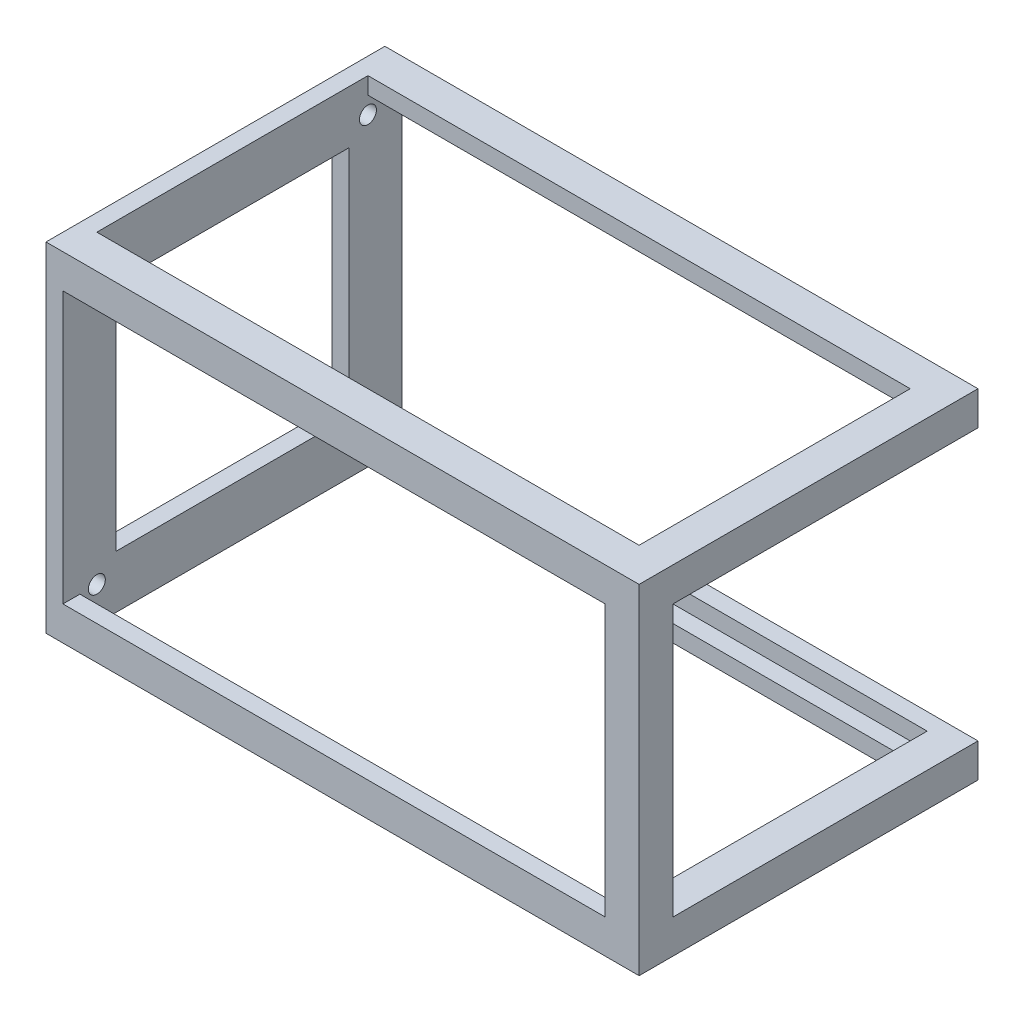
ISO-10303-21;
HEADER;
FILE_DESCRIPTION(('STEP AP214'),'2;1');
FILE_NAME('part.step','',(''),(''),'','','');
FILE_SCHEMA(('AUTOMOTIVE_DESIGN { 1 0 10303 214 1 1 1 1 }'));
ENDSEC;
DATA;
#1=APPLICATION_CONTEXT('core data for automotive mechanical design processes');
#2=APPLICATION_PROTOCOL_DEFINITION('international standard','automotive_design',2000,#1);
#3=PRODUCT_CONTEXT('',#1,'mechanical');
#4=PRODUCT('Part','Part','',(#3));
#5=PRODUCT_RELATED_PRODUCT_CATEGORY('part','',(#4));
#6=PRODUCT_DEFINITION_FORMATION('','',#4);
#7=PRODUCT_DEFINITION_CONTEXT('part definition',#1,'design');
#8=PRODUCT_DEFINITION('design','',#6,#7);
#9=PRODUCT_DEFINITION_SHAPE('','',#8);
#10=(LENGTH_UNIT() NAMED_UNIT(*) SI_UNIT(.MILLI.,.METRE.));
#11=(NAMED_UNIT(*) PLANE_ANGLE_UNIT() SI_UNIT($,.RADIAN.));
#12=(NAMED_UNIT(*) SI_UNIT($,.STERADIAN.) SOLID_ANGLE_UNIT());
#13=UNCERTAINTY_MEASURE_WITH_UNIT(LENGTH_MEASURE(1.E-05),#10,'distance_accuracy_value','');
#14=(GEOMETRIC_REPRESENTATION_CONTEXT(3) GLOBAL_UNCERTAINTY_ASSIGNED_CONTEXT((#13)) GLOBAL_UNIT_ASSIGNED_CONTEXT((#10,
#11,#12)) REPRESENTATION_CONTEXT('',''));
#15=CARTESIAN_POINT('',(0.,0.,0.));
#16=DIRECTION('',(0.,0.,1.));
#17=DIRECTION('',(1.,0.,0.));
#18=AXIS2_PLACEMENT_3D('',#15,#16,#17);
#19=CARTESIAN_POINT('',(4.,-36.,36.));
#20=DIRECTION('',(0.,-1.,0.));
#21=DIRECTION('',(0.,0.,-1.));
#22=AXIS2_PLACEMENT_3D('',#19,#20,#21);
#23=PLANE('',#22);
#24=DIRECTION('',(0.,0.,1.));
#25=VECTOR('',#24,1.);
#26=CARTESIAN_POINT('',(132.,-36.,36.));
#27=LINE('',#26,#25);
#28=CARTESIAN_POINT('',(132.,-36.,32.0006053791459));
#29=VERTEX_POINT('',#28);
#30=CARTESIAN_POINT('',(132.,-36.,36.));
#31=VERTEX_POINT('',#30);
#32=EDGE_CURVE('E280',#29,#31,#27,.T.);
#33=ORIENTED_EDGE('',*,*,#32,.F.);
#34=DIRECTION('',(1.,0.,0.));
#35=VECTOR('',#34,1.);
#36=CARTESIAN_POINT('',(4.,-36.,32.0006053791459));
#37=LINE('',#36,#35);
#38=CARTESIAN_POINT('',(4.,-36.,32.0006053791459));
#39=VERTEX_POINT('',#38);
#40=EDGE_CURVE('E427',#39,#29,#37,.T.);
#41=ORIENTED_EDGE('',*,*,#40,.F.);
#42=DIRECTION('',(0.,0.,-1.));
#43=VECTOR('',#42,1.);
#44=CARTESIAN_POINT('',(4.,-36.,36.));
#45=LINE('',#44,#43);
#46=CARTESIAN_POINT('',(4.,-36.,36.));
#47=VERTEX_POINT('',#46);
#48=EDGE_CURVE('E367',#47,#39,#45,.T.);
#49=ORIENTED_EDGE('',*,*,#48,.F.);
#50=DIRECTION('',(1.,0.,0.));
#51=VECTOR('',#50,1.);
#52=CARTESIAN_POINT('',(4.,-36.,36.));
#53=LINE('',#52,#51);
#54=EDGE_CURVE('E433',#47,#31,#53,.T.);
#55=ORIENTED_EDGE('',*,*,#54,.T.);
#56=EDGE_LOOP('',(#33,#41,#49,#55));
#57=FACE_BOUND('',#56,.T.);
#58=ADVANCED_FACE('F39',(#57),#23,.F.);
#59=CARTESIAN_POINT('',(4.,-36.,36.));
#60=DIRECTION('',(0.,0.,1.));
#61=DIRECTION('',(1.,0.,0.));
#62=AXIS2_PLACEMENT_3D('',#59,#60,#61);
#63=PLANE('',#62);
#64=DIRECTION('',(0.,1.,0.));
#65=VECTOR('',#64,1.);
#66=CARTESIAN_POINT('',(132.,-36.,36.));
#67=LINE('',#66,#65);
#68=CARTESIAN_POINT('',(132.,-32.,36.));
#69=VERTEX_POINT('',#68);
#70=EDGE_CURVE('E53',#31,#69,#67,.T.);
#71=ORIENTED_EDGE('',*,*,#70,.F.);
#72=ORIENTED_EDGE('',*,*,#54,.F.);
#73=DIRECTION('',(0.,-1.,0.));
#74=VECTOR('',#73,1.);
#75=CARTESIAN_POINT('',(4.,-36.,36.));
#76=LINE('',#75,#74);
#77=CARTESIAN_POINT('',(4.,-32.,36.));
#78=VERTEX_POINT('',#77);
#79=EDGE_CURVE('E430',#78,#47,#76,.T.);
#80=ORIENTED_EDGE('',*,*,#79,.F.);
#81=DIRECTION('',(1.,0.,0.));
#82=VECTOR('',#81,1.);
#83=CARTESIAN_POINT('',(4.,-32.,36.));
#84=LINE('',#83,#82);
#85=EDGE_CURVE('E436',#78,#69,#84,.T.);
#86=ORIENTED_EDGE('',*,*,#85,.T.);
#87=EDGE_LOOP('',(#71,#72,#80,#86));
#88=FACE_BOUND('',#87,.T.);
#89=ADVANCED_FACE('F561',(#88),#63,.F.);
#90=CARTESIAN_POINT('',(4.,-32.,40.));
#91=DIRECTION('',(0.,-1.,0.));
#92=DIRECTION('',(0.,0.,-1.));
#93=AXIS2_PLACEMENT_3D('',#90,#91,#92);
#94=PLANE('',#93);
#95=DIRECTION('',(0.,0.,1.));
#96=VECTOR('',#95,1.);
#97=CARTESIAN_POINT('',(132.,-32.,40.));
#98=LINE('',#97,#96);
#99=CARTESIAN_POINT('',(132.,-32.,40.));
#100=VERTEX_POINT('',#99);
#101=EDGE_CURVE('E285',#69,#100,#98,.T.);
#102=ORIENTED_EDGE('',*,*,#101,.F.);
#103=ORIENTED_EDGE('',*,*,#85,.F.);
#104=DIRECTION('',(0.,0.,-1.));
#105=VECTOR('',#104,1.);
#106=CARTESIAN_POINT('',(4.,-32.,40.));
#107=LINE('',#106,#105);
#108=CARTESIAN_POINT('',(4.,-32.,40.));
#109=VERTEX_POINT('',#108);
#110=EDGE_CURVE('E425',#109,#78,#107,.T.);
#111=ORIENTED_EDGE('',*,*,#110,.F.);
#112=DIRECTION('',(1.,0.,0.));
#113=VECTOR('',#112,1.);
#114=CARTESIAN_POINT('',(4.,-32.,40.));
#115=LINE('',#114,#113);
#116=EDGE_CURVE('E65',#109,#100,#115,.T.);
#117=ORIENTED_EDGE('',*,*,#116,.T.);
#118=EDGE_LOOP('',(#102,#103,#111,#117));
#119=FACE_BOUND('',#118,.T.);
#120=ADVANCED_FACE('F563',(#119),#94,.F.);
#121=CARTESIAN_POINT('',(4.,32.,40.));
#122=DIRECTION('',(0.,1.,0.));
#123=DIRECTION('',(0.,0.,1.));
#124=AXIS2_PLACEMENT_3D('',#121,#122,#123);
#125=PLANE('',#124);
#126=DIRECTION('',(0.,0.,-1.));
#127=VECTOR('',#126,1.);
#128=CARTESIAN_POINT('',(132.,32.,40.));
#129=LINE('',#128,#127);
#130=CARTESIAN_POINT('',(132.,32.,40.));
#131=VERTEX_POINT('',#130);
#132=CARTESIAN_POINT('',(132.,32.,36.));
#133=VERTEX_POINT('',#132);
#134=EDGE_CURVE('E307',#131,#133,#129,.T.);
#135=ORIENTED_EDGE('',*,*,#134,.F.);
#136=DIRECTION('',(1.,0.,0.));
#137=VECTOR('',#136,1.);
#138=CARTESIAN_POINT('',(4.,32.,40.));
#139=LINE('',#138,#137);
#140=CARTESIAN_POINT('',(4.,32.,40.));
#141=VERTEX_POINT('',#140);
#142=EDGE_CURVE('E437',#141,#131,#139,.T.);
#143=ORIENTED_EDGE('',*,*,#142,.F.);
#144=DIRECTION('',(0.,0.,1.));
#145=VECTOR('',#144,1.);
#146=CARTESIAN_POINT('',(4.,32.,40.));
#147=LINE('',#146,#145);
#148=CARTESIAN_POINT('',(4.,32.,36.));
#149=VERTEX_POINT('',#148);
#150=EDGE_CURVE('E418',#149,#141,#147,.T.);
#151=ORIENTED_EDGE('',*,*,#150,.F.);
#152=DIRECTION('',(1.,0.,0.));
#153=VECTOR('',#152,1.);
#154=CARTESIAN_POINT('',(4.,32.,36.));
#155=LINE('',#154,#153);
#156=EDGE_CURVE('E445',#149,#133,#155,.T.);
#157=ORIENTED_EDGE('',*,*,#156,.T.);
#158=EDGE_LOOP('',(#135,#143,#151,#157));
#159=FACE_BOUND('',#158,.T.);
#160=ADVANCED_FACE('F566',(#159),#125,.F.);
#161=CARTESIAN_POINT('',(4.,36.,36.));
#162=DIRECTION('',(0.,0.,1.));
#163=DIRECTION('',(1.,0.,0.));
#164=AXIS2_PLACEMENT_3D('',#161,#162,#163);
#165=PLANE('',#164);
#166=DIRECTION('',(0.,1.,0.));
#167=VECTOR('',#166,1.);
#168=CARTESIAN_POINT('',(132.,36.,36.));
#169=LINE('',#168,#167);
#170=CARTESIAN_POINT('',(132.,36.,36.));
#171=VERTEX_POINT('',#170);
#172=EDGE_CURVE('E306',#133,#171,#169,.T.);
#173=ORIENTED_EDGE('',*,*,#172,.F.);
#174=ORIENTED_EDGE('',*,*,#156,.F.);
#175=DIRECTION('',(0.,-1.,0.));
#176=VECTOR('',#175,1.);
#177=CARTESIAN_POINT('',(4.,36.,36.));
#178=LINE('',#177,#176);
#179=CARTESIAN_POINT('',(4.,36.,36.));
#180=VERTEX_POINT('',#179);
#181=EDGE_CURVE('E413',#180,#149,#178,.T.);
#182=ORIENTED_EDGE('',*,*,#181,.F.);
#183=DIRECTION('',(1.,0.,0.));
#184=VECTOR('',#183,1.);
#185=CARTESIAN_POINT('',(4.,36.,36.));
#186=LINE('',#185,#184);
#187=EDGE_CURVE('E444',#180,#171,#186,.T.);
#188=ORIENTED_EDGE('',*,*,#187,.T.);
#189=EDGE_LOOP('',(#173,#174,#182,#188));
#190=FACE_BOUND('',#189,.T.);
#191=ADVANCED_FACE('F569',(#190),#165,.F.);
#192=CARTESIAN_POINT('',(4.,36.,36.));
#193=DIRECTION('',(0.,1.,0.));
#194=DIRECTION('',(0.,0.,1.));
#195=AXIS2_PLACEMENT_3D('',#192,#193,#194);
#196=PLANE('',#195);
#197=DIRECTION('',(0.,0.,-1.));
#198=VECTOR('',#197,1.);
#199=CARTESIAN_POINT('',(132.,36.,36.));
#200=LINE('',#199,#198);
#201=CARTESIAN_POINT('',(132.,36.,32.0006053791459));
#202=VERTEX_POINT('',#201);
#203=EDGE_CURVE('E303',#171,#202,#200,.T.);
#204=ORIENTED_EDGE('',*,*,#203,.F.);
#205=ORIENTED_EDGE('',*,*,#187,.F.);
#206=DIRECTION('',(0.,0.,1.));
#207=VECTOR('',#206,1.);
#208=CARTESIAN_POINT('',(4.,36.,36.));
#209=LINE('',#208,#207);
#210=CARTESIAN_POINT('',(4.,36.,32.0006053791459));
#211=VERTEX_POINT('',#210);
#212=EDGE_CURVE('E415',#211,#180,#209,.T.);
#213=ORIENTED_EDGE('',*,*,#212,.F.);
#214=DIRECTION('',(1.,0.,0.));
#215=VECTOR('',#214,1.);
#216=CARTESIAN_POINT('',(4.,36.,32.0006053791459));
#217=LINE('',#216,#215);
#218=EDGE_CURVE('E449',#211,#202,#217,.T.);
#219=ORIENTED_EDGE('',*,*,#218,.T.);
#220=EDGE_LOOP('',(#204,#205,#213,#219));
#221=FACE_BOUND('',#220,.T.);
#222=ADVANCED_FACE('F572',(#221),#196,.F.);
#223=CARTESIAN_POINT('',(4.,40.,32.0006053791459));
#224=DIRECTION('',(0.,0.,1.));
#225=DIRECTION('',(0.,-1.,0.));
#226=AXIS2_PLACEMENT_3D('',#223,#224,#225);
#227=PLANE('',#226);
#228=DIRECTION('',(0.,1.,0.));
#229=VECTOR('',#228,1.);
#230=CARTESIAN_POINT('',(132.,40.,32.0006053791459));
#231=LINE('',#230,#229);
#232=CARTESIAN_POINT('',(132.,40.,32.0006053791459));
#233=VERTEX_POINT('',#232);
#234=EDGE_CURVE('E297',#202,#233,#231,.T.);
#235=ORIENTED_EDGE('',*,*,#234,.F.);
#236=ORIENTED_EDGE('',*,*,#218,.F.);
#237=DIRECTION('',(0.,-1.,0.));
#238=VECTOR('',#237,1.);
#239=CARTESIAN_POINT('',(4.,40.,32.0006053791459));
#240=LINE('',#239,#238);
#241=CARTESIAN_POINT('',(4.,40.,32.0006053791459));
#242=VERTEX_POINT('',#241);
#243=EDGE_CURVE('E406',#242,#211,#240,.T.);
#244=ORIENTED_EDGE('',*,*,#243,.F.);
#245=DIRECTION('',(1.,0.,0.));
#246=VECTOR('',#245,1.);
#247=CARTESIAN_POINT('',(4.,40.,32.0006053791459));
#248=LINE('',#247,#246);
#249=EDGE_CURVE('E452',#242,#233,#248,.T.);
#250=ORIENTED_EDGE('',*,*,#249,.T.);
#251=EDGE_LOOP('',(#235,#236,#244,#250));
#252=FACE_BOUND('',#251,.T.);
#253=ADVANCED_FACE('F574',(#252),#227,.F.);
#254=CARTESIAN_POINT('',(4.,40.,-32.0006053791459));
#255=DIRECTION('',(0.,0.,-1.));
#256=DIRECTION('',(0.,1.,0.));
#257=AXIS2_PLACEMENT_3D('',#254,#255,#256);
#258=PLANE('',#257);
#259=DIRECTION('',(0.,-1.,0.));
#260=VECTOR('',#259,1.);
#261=CARTESIAN_POINT('',(132.,40.,-32.0006053791459));
#262=LINE('',#261,#260);
#263=CARTESIAN_POINT('',(132.,40.,-32.0006053791459));
#264=VERTEX_POINT('',#263);
#265=CARTESIAN_POINT('',(132.,36.,-32.0006053791459));
#266=VERTEX_POINT('',#265);
#267=EDGE_CURVE('E300',#264,#266,#262,.T.);
#268=ORIENTED_EDGE('',*,*,#267,.F.);
#269=DIRECTION('',(1.,0.,0.));
#270=VECTOR('',#269,1.);
#271=CARTESIAN_POINT('',(4.,40.,-32.0006053791459));
#272=LINE('',#271,#270);
#273=CARTESIAN_POINT('',(4.,40.,-32.0006053791459));
#274=VERTEX_POINT('',#273);
#275=EDGE_CURVE('E454',#274,#264,#272,.T.);
#276=ORIENTED_EDGE('',*,*,#275,.F.);
#277=DIRECTION('',(0.,1.,0.));
#278=VECTOR('',#277,1.);
#279=CARTESIAN_POINT('',(4.,40.,-32.0006053791459));
#280=LINE('',#279,#278);
#281=CARTESIAN_POINT('',(4.,36.,-32.0006053791459));
#282=VERTEX_POINT('',#281);
#283=EDGE_CURVE('E401',#282,#274,#280,.T.);
#284=ORIENTED_EDGE('',*,*,#283,.F.);
#285=DIRECTION('',(1.,0.,0.));
#286=VECTOR('',#285,1.);
#287=CARTESIAN_POINT('',(4.,36.,-32.0006053791459));
#288=LINE('',#287,#286);
#289=EDGE_CURVE('E457',#282,#266,#288,.T.);
#290=ORIENTED_EDGE('',*,*,#289,.T.);
#291=EDGE_LOOP('',(#268,#276,#284,#290));
#292=FACE_BOUND('',#291,.T.);
#293=ADVANCED_FACE('F576',(#292),#258,.F.);
#294=CARTESIAN_POINT('',(4.,36.,-36.));
#295=DIRECTION('',(0.,1.,0.));
#296=DIRECTION('',(0.,0.,1.));
#297=AXIS2_PLACEMENT_3D('',#294,#295,#296);
#298=PLANE('',#297);
#299=DIRECTION('',(0.,0.,-1.));
#300=VECTOR('',#299,1.);
#301=CARTESIAN_POINT('',(132.,36.,-36.));
#302=LINE('',#301,#300);
#303=CARTESIAN_POINT('',(132.,36.,-36.));
#304=VERTEX_POINT('',#303);
#305=EDGE_CURVE('E295',#266,#304,#302,.T.);
#306=ORIENTED_EDGE('',*,*,#305,.F.);
#307=ORIENTED_EDGE('',*,*,#289,.F.);
#308=DIRECTION('',(0.,0.,1.));
#309=VECTOR('',#308,1.);
#310=CARTESIAN_POINT('',(4.,36.,-36.));
#311=LINE('',#310,#309);
#312=CARTESIAN_POINT('',(4.,36.,-36.));
#313=VERTEX_POINT('',#312);
#314=EDGE_CURVE('E396',#313,#282,#311,.T.);
#315=ORIENTED_EDGE('',*,*,#314,.F.);
#316=DIRECTION('',(1.,0.,0.));
#317=VECTOR('',#316,1.);
#318=CARTESIAN_POINT('',(4.,36.,-36.));
#319=LINE('',#318,#317);
#320=EDGE_CURVE('E456',#313,#304,#319,.T.);
#321=ORIENTED_EDGE('',*,*,#320,.T.);
#322=EDGE_LOOP('',(#306,#307,#315,#321));
#323=FACE_BOUND('',#322,.T.);
#324=ADVANCED_FACE('F584',(#323),#298,.F.);
#325=CARTESIAN_POINT('',(4.,36.,-36.));
#326=DIRECTION('',(0.,0.,-1.));
#327=DIRECTION('',(-1.,0.,0.));
#328=AXIS2_PLACEMENT_3D('',#325,#326,#327);
#329=PLANE('',#328);
#330=DIRECTION('',(0.,-1.,0.));
#331=VECTOR('',#330,1.);
#332=CARTESIAN_POINT('',(132.,36.,-36.));
#333=LINE('',#332,#331);
#334=CARTESIAN_POINT('',(132.,32.,-36.));
#335=VERTEX_POINT('',#334);
#336=EDGE_CURVE('E292',#304,#335,#333,.T.);
#337=ORIENTED_EDGE('',*,*,#336,.F.);
#338=ORIENTED_EDGE('',*,*,#320,.F.);
#339=DIRECTION('',(0.,1.,0.));
#340=VECTOR('',#339,1.);
#341=CARTESIAN_POINT('',(4.,36.,-36.));
#342=LINE('',#341,#340);
#343=CARTESIAN_POINT('',(4.,32.,-36.));
#344=VERTEX_POINT('',#343);
#345=EDGE_CURVE('E400',#344,#313,#342,.T.);
#346=ORIENTED_EDGE('',*,*,#345,.F.);
#347=DIRECTION('',(1.,0.,0.));
#348=VECTOR('',#347,1.);
#349=CARTESIAN_POINT('',(4.,32.,-36.));
#350=LINE('',#349,#348);
#351=EDGE_CURVE('E465',#344,#335,#350,.T.);
#352=ORIENTED_EDGE('',*,*,#351,.T.);
#353=EDGE_LOOP('',(#337,#338,#346,#352));
#354=FACE_BOUND('',#353,.T.);
#355=ADVANCED_FACE('F583',(#354),#329,.F.);
#356=CARTESIAN_POINT('',(4.,-36.,-36.));
#357=DIRECTION('',(0.,0.,-1.));
#358=DIRECTION('',(-1.,0.,0.));
#359=AXIS2_PLACEMENT_3D('',#356,#357,#358);
#360=PLANE('',#359);
#361=DIRECTION('',(0.,-1.,0.));
#362=VECTOR('',#361,1.);
#363=CARTESIAN_POINT('',(132.,-36.,-36.));
#364=LINE('',#363,#362);
#365=CARTESIAN_POINT('',(132.,-32.,-36.));
#366=VERTEX_POINT('',#365);
#367=CARTESIAN_POINT('',(132.,-36.,-36.));
#368=VERTEX_POINT('',#367);
#369=EDGE_CURVE('E286',#366,#368,#364,.T.);
#370=ORIENTED_EDGE('',*,*,#369,.F.);
#371=DIRECTION('',(1.,0.,0.));
#372=VECTOR('',#371,1.);
#373=CARTESIAN_POINT('',(4.,-32.,-36.));
#374=LINE('',#373,#372);
#375=CARTESIAN_POINT('',(4.,-32.,-36.));
#376=VERTEX_POINT('',#375);
#377=EDGE_CURVE('E244',#376,#366,#374,.T.);
#378=ORIENTED_EDGE('',*,*,#377,.F.);
#379=DIRECTION('',(0.,1.,0.));
#380=VECTOR('',#379,1.);
#381=CARTESIAN_POINT('',(4.,-36.,-36.));
#382=LINE('',#381,#380);
#383=CARTESIAN_POINT('',(4.,-36.,-36.));
#384=VERTEX_POINT('',#383);
#385=EDGE_CURVE('E383',#384,#376,#382,.T.);
#386=ORIENTED_EDGE('',*,*,#385,.F.);
#387=DIRECTION('',(1.,0.,0.));
#388=VECTOR('',#387,1.);
#389=CARTESIAN_POINT('',(4.,-36.,-36.));
#390=LINE('',#389,#388);
#391=EDGE_CURVE('E469',#384,#368,#390,.T.);
#392=ORIENTED_EDGE('',*,*,#391,.T.);
#393=EDGE_LOOP('',(#370,#378,#386,#392));
#394=FACE_BOUND('',#393,.T.);
#395=ADVANCED_FACE('F543',(#394),#360,.F.);
#396=CARTESIAN_POINT('',(4.,-36.,-36.));
#397=DIRECTION('',(0.,-1.,0.));
#398=DIRECTION('',(0.,0.,-1.));
#399=AXIS2_PLACEMENT_3D('',#396,#397,#398);
#400=PLANE('',#399);
#401=DIRECTION('',(0.,0.,1.));
#402=VECTOR('',#401,1.);
#403=CARTESIAN_POINT('',(132.,-36.,-36.));
#404=LINE('',#403,#402);
#405=CARTESIAN_POINT('',(132.,-36.,-32.0006053791459));
#406=VERTEX_POINT('',#405);
#407=EDGE_CURVE('E290',#368,#406,#404,.T.);
#408=ORIENTED_EDGE('',*,*,#407,.F.);
#409=ORIENTED_EDGE('',*,*,#391,.F.);
#410=DIRECTION('',(0.,0.,-1.));
#411=VECTOR('',#410,1.);
#412=CARTESIAN_POINT('',(4.,-36.,-36.));
#413=LINE('',#412,#411);
#414=CARTESIAN_POINT('',(4.,-36.,-32.0006053791459));
#415=VERTEX_POINT('',#414);
#416=EDGE_CURVE('E385',#415,#384,#413,.T.);
#417=ORIENTED_EDGE('',*,*,#416,.F.);
#418=DIRECTION('',(1.,0.,0.));
#419=VECTOR('',#418,1.);
#420=CARTESIAN_POINT('',(4.,-36.,-32.0006053791459));
#421=LINE('',#420,#419);
#422=EDGE_CURVE('E475',#415,#406,#421,.T.);
#423=ORIENTED_EDGE('',*,*,#422,.T.);
#424=EDGE_LOOP('',(#408,#409,#417,#423));
#425=FACE_BOUND('',#424,.T.);
#426=ADVANCED_FACE('F549',(#425),#400,.F.);
#427=CARTESIAN_POINT('',(4.,-40.,-32.0006053791459));
#428=DIRECTION('',(0.,0.,-1.));
#429=DIRECTION('',(0.,1.,0.));
#430=AXIS2_PLACEMENT_3D('',#427,#428,#429);
#431=PLANE('',#430);
#432=DIRECTION('',(0.,-1.,0.));
#433=VECTOR('',#432,1.);
#434=CARTESIAN_POINT('',(132.,-40.,-32.0006053791459));
#435=LINE('',#434,#433);
#436=CARTESIAN_POINT('',(132.,-40.,-32.0006053791459));
#437=VERTEX_POINT('',#436);
#438=EDGE_CURVE('E281',#406,#437,#435,.T.);
#439=ORIENTED_EDGE('',*,*,#438,.F.);
#440=ORIENTED_EDGE('',*,*,#422,.F.);
#441=DIRECTION('',(0.,1.,0.));
#442=VECTOR('',#441,1.);
#443=CARTESIAN_POINT('',(4.,-40.,-32.0006053791459));
#444=LINE('',#443,#442);
#445=CARTESIAN_POINT('',(4.,-40.,-32.0006053791459));
#446=VERTEX_POINT('',#445);
#447=EDGE_CURVE('E378',#446,#415,#444,.T.);
#448=ORIENTED_EDGE('',*,*,#447,.F.);
#449=DIRECTION('',(1.,0.,0.));
#450=VECTOR('',#449,1.);
#451=CARTESIAN_POINT('',(4.,-40.,-32.0006053791459));
#452=LINE('',#451,#450);
#453=EDGE_CURVE('E473',#446,#437,#452,.T.);
#454=ORIENTED_EDGE('',*,*,#453,.T.);
#455=EDGE_LOOP('',(#439,#440,#448,#454));
#456=FACE_BOUND('',#455,.T.);
#457=ADVANCED_FACE('F553',(#456),#431,.F.);
#458=CARTESIAN_POINT('',(4.,-40.,32.0006053791459));
#459=DIRECTION('',(0.,0.,1.));
#460=DIRECTION('',(0.,-1.,0.));
#461=AXIS2_PLACEMENT_3D('',#458,#459,#460);
#462=PLANE('',#461);
#463=DIRECTION('',(0.,1.,0.));
#464=VECTOR('',#463,1.);
#465=CARTESIAN_POINT('',(132.,-40.,32.0006053791459));
#466=LINE('',#465,#464);
#467=CARTESIAN_POINT('',(132.,-40.,32.0006053791459));
#468=VERTEX_POINT('',#467);
#469=EDGE_CURVE('E11',#468,#29,#466,.T.);
#470=ORIENTED_EDGE('',*,*,#469,.F.);
#471=DIRECTION('',(1.,0.,0.));
#472=VECTOR('',#471,1.);
#473=CARTESIAN_POINT('',(4.,-40.,32.0006053791459));
#474=LINE('',#473,#472);
#475=CARTESIAN_POINT('',(4.,-40.,32.0006053791459));
#476=VERTEX_POINT('',#475);
#477=EDGE_CURVE('E480',#476,#468,#474,.T.);
#478=ORIENTED_EDGE('',*,*,#477,.F.);
#479=DIRECTION('',(0.,-1.,0.));
#480=VECTOR('',#479,1.);
#481=CARTESIAN_POINT('',(4.,-40.,32.0006053791459));
#482=LINE('',#481,#480);
#483=EDGE_CURVE('E375',#39,#476,#482,.T.);
#484=ORIENTED_EDGE('',*,*,#483,.F.);
#485=ORIENTED_EDGE('',*,*,#40,.T.);
#486=EDGE_LOOP('',(#470,#478,#484,#485));
#487=FACE_BOUND('',#486,.T.);
#488=ADVANCED_FACE('F558',(#487),#462,.F.);
#489=CARTESIAN_POINT('',(140.,-40.,40.));
#490=DIRECTION('',(0.,1.,0.));
#491=DIRECTION('',(0.,0.,1.));
#492=AXIS2_PLACEMENT_3D('',#489,#490,#491);
#493=PLANE('',#492);
#494=DIRECTION('',(-1.,0.,0.));
#495=VECTOR('',#494,1.);
#496=CARTESIAN_POINT('',(140.,-40.,-40.));
#497=LINE('',#496,#495);
#498=CARTESIAN_POINT('',(140.,-40.,-40.));
#499=VERTEX_POINT('',#498);
#500=CARTESIAN_POINT('',(0.,-40.,-40.));
#501=VERTEX_POINT('',#500);
#502=EDGE_CURVE('E50',#499,#501,#497,.T.);
#503=ORIENTED_EDGE('',*,*,#502,.F.);
#504=DIRECTION('',(0.,0.,-1.));
#505=VECTOR('',#504,1.);
#506=CARTESIAN_POINT('',(140.,-40.,40.));
#507=LINE('',#506,#505);
#508=CARTESIAN_POINT('',(140.,-40.,40.));
#509=VERTEX_POINT('',#508);
#510=EDGE_CURVE('E482',#509,#499,#507,.T.);
#511=ORIENTED_EDGE('',*,*,#510,.F.);
#512=DIRECTION('',(-1.,0.,0.));
#513=VECTOR('',#512,1.);
#514=CARTESIAN_POINT('',(140.,-40.,40.));
#515=LINE('',#514,#513);
#516=CARTESIAN_POINT('',(0.,-40.,40.));
#517=VERTEX_POINT('',#516);
#518=EDGE_CURVE('E495',#509,#517,#515,.T.);
#519=ORIENTED_EDGE('',*,*,#518,.T.);
#520=DIRECTION('',(0.,0.,-1.));
#521=VECTOR('',#520,1.);
#522=CARTESIAN_POINT('',(0.,-40.,40.));
#523=LINE('',#522,#521);
#524=EDGE_CURVE('E434',#517,#501,#523,.T.);
#525=ORIENTED_EDGE('',*,*,#524,.T.);
#526=EDGE_LOOP('',(#503,#511,#519,#525));
#527=FACE_BOUND('',#526,.T.);
#528=ORIENTED_EDGE('',*,*,#477,.T.);
#529=DIRECTION('',(0.,0.,-1.));
#530=VECTOR('',#529,1.);
#531=CARTESIAN_POINT('',(132.,-40.,40.));
#532=LINE('',#531,#530);
#533=EDGE_CURVE('E249',#468,#437,#532,.T.);
#534=ORIENTED_EDGE('',*,*,#533,.T.);
#535=ORIENTED_EDGE('',*,*,#453,.F.);
#536=DIRECTION('',(0.,0.,-1.));
#537=VECTOR('',#536,1.);
#538=CARTESIAN_POINT('',(4.,-40.,32.0006053791459));
#539=LINE('',#538,#537);
#540=EDGE_CURVE('E376',#476,#446,#539,.T.);
#541=ORIENTED_EDGE('',*,*,#540,.F.);
#542=EDGE_LOOP('',(#528,#534,#535,#541));
#543=FACE_BOUND('',#542,.T.);
#544=ADVANCED_FACE('F41',(#527,#543),#493,.F.);
#545=CARTESIAN_POINT('',(140.,-40.,-40.));
#546=DIRECTION('',(0.,0.,1.));
#547=DIRECTION('',(1.,0.,0.));
#548=AXIS2_PLACEMENT_3D('',#545,#546,#547);
#549=PLANE('',#548);
#550=ORIENTED_EDGE('',*,*,#502,.T.);
#551=DIRECTION('',(0.,1.,0.));
#552=VECTOR('',#551,1.);
#553=CARTESIAN_POINT('',(0.,-40.,-40.));
#554=LINE('',#553,#552);
#555=CARTESIAN_POINT('',(0.,40.,-40.));
#556=VERTEX_POINT('',#555);
#557=EDGE_CURVE('E492',#501,#556,#554,.T.);
#558=ORIENTED_EDGE('',*,*,#557,.T.);
#559=DIRECTION('',(-1.,0.,0.));
#560=VECTOR('',#559,1.);
#561=CARTESIAN_POINT('',(140.,40.,-40.));
#562=LINE('',#561,#560);
#563=CARTESIAN_POINT('',(140.,40.,-40.));
#564=VERTEX_POINT('',#563);
#565=EDGE_CURVE('E506',#564,#556,#562,.T.);
#566=ORIENTED_EDGE('',*,*,#565,.F.);
#567=DIRECTION('',(0.,1.,0.));
#568=VECTOR('',#567,1.);
#569=CARTESIAN_POINT('',(140.,-40.,-40.));
#570=LINE('',#569,#568);
#571=CARTESIAN_POINT('',(140.,32.,-40.));
#572=VERTEX_POINT('',#571);
#573=EDGE_CURVE('E483',#572,#564,#570,.T.);
#574=ORIENTED_EDGE('',*,*,#573,.F.);
#575=DIRECTION('',(1.,0.,0.));
#576=VECTOR('',#575,1.);
#577=CARTESIAN_POINT('',(4.,32.,-40.));
#578=LINE('',#577,#576);
#579=CARTESIAN_POINT('',(4.,32.,-40.));
#580=VERTEX_POINT('',#579);
#581=EDGE_CURVE('E464',#580,#572,#578,.T.);
#582=ORIENTED_EDGE('',*,*,#581,.F.);
#583=DIRECTION('',(0.,1.,0.));
#584=VECTOR('',#583,1.);
#585=CARTESIAN_POINT('',(4.,-32.,-40.));
#586=LINE('',#585,#584);
#587=CARTESIAN_POINT('',(4.,-32.,-40.));
#588=VERTEX_POINT('',#587);
#589=EDGE_CURVE('E392',#588,#580,#586,.T.);
#590=ORIENTED_EDGE('',*,*,#589,.F.);
#591=DIRECTION('',(1.,0.,0.));
#592=VECTOR('',#591,1.);
#593=CARTESIAN_POINT('',(4.,-32.,-40.));
#594=LINE('',#593,#592);
#595=CARTESIAN_POINT('',(140.,-32.,-40.));
#596=VERTEX_POINT('',#595);
#597=EDGE_CURVE('E467',#588,#596,#594,.T.);
#598=ORIENTED_EDGE('',*,*,#597,.T.);
#599=EDGE_CURVE('E481',#499,#596,#570,.T.);
#600=ORIENTED_EDGE('',*,*,#599,.F.);
#601=EDGE_LOOP('',(#550,#558,#566,#574,#582,#590,#598,#600));
#602=FACE_BOUND('',#601,.T.);
#603=ADVANCED_FACE('F512',(#602),#549,.F.);
#604=CARTESIAN_POINT('',(140.,40.,40.));
#605=DIRECTION('',(0.,-1.,0.));
#606=DIRECTION('',(0.,0.,-1.));
#607=AXIS2_PLACEMENT_3D('',#604,#605,#606);
#608=PLANE('',#607);
#609=DIRECTION('',(-1.,0.,0.));
#610=VECTOR('',#609,1.);
#611=CARTESIAN_POINT('',(140.,40.,40.));
#612=LINE('',#611,#610);
#613=CARTESIAN_POINT('',(140.,40.,40.));
#614=VERTEX_POINT('',#613);
#615=CARTESIAN_POINT('',(0.,40.,40.));
#616=VERTEX_POINT('',#615);
#617=EDGE_CURVE('E502',#614,#616,#612,.T.);
#618=ORIENTED_EDGE('',*,*,#617,.F.);
#619=DIRECTION('',(0.,0.,1.));
#620=VECTOR('',#619,1.);
#621=CARTESIAN_POINT('',(140.,40.,40.));
#622=LINE('',#621,#620);
#623=EDGE_CURVE('E486',#564,#614,#622,.T.);
#624=ORIENTED_EDGE('',*,*,#623,.F.);
#625=ORIENTED_EDGE('',*,*,#565,.T.);
#626=DIRECTION('',(0.,0.,1.));
#627=VECTOR('',#626,1.);
#628=CARTESIAN_POINT('',(0.,40.,40.));
#629=LINE('',#628,#627);
#630=EDGE_CURVE('E498',#556,#616,#629,.T.);
#631=ORIENTED_EDGE('',*,*,#630,.T.);
#632=EDGE_LOOP('',(#618,#624,#625,#631));
#633=FACE_BOUND('',#632,.T.);
#634=ORIENTED_EDGE('',*,*,#275,.T.);
#635=DIRECTION('',(0.,0.,1.));
#636=VECTOR('',#635,1.);
#637=CARTESIAN_POINT('',(132.,40.,40.));
#638=LINE('',#637,#636);
#639=EDGE_CURVE('E268',#264,#233,#638,.T.);
#640=ORIENTED_EDGE('',*,*,#639,.T.);
#641=ORIENTED_EDGE('',*,*,#249,.F.);
#642=DIRECTION('',(0.,0.,1.));
#643=VECTOR('',#642,1.);
#644=CARTESIAN_POINT('',(4.,40.,32.0006053791459));
#645=LINE('',#644,#643);
#646=EDGE_CURVE('E407',#274,#242,#645,.T.);
#647=ORIENTED_EDGE('',*,*,#646,.F.);
#648=EDGE_LOOP('',(#634,#640,#641,#647));
#649=FACE_BOUND('',#648,.T.);
#650=ADVANCED_FACE('F529',(#633,#649),#608,.F.);
#651=CARTESIAN_POINT('',(140.,-40.,40.));
#652=DIRECTION('',(0.,0.,-1.));
#653=DIRECTION('',(0.,1.,0.));
#654=AXIS2_PLACEMENT_3D('',#651,#652,#653);
#655=PLANE('',#654);
#656=ORIENTED_EDGE('',*,*,#518,.F.);
#657=DIRECTION('',(0.,-1.,0.));
#658=VECTOR('',#657,1.);
#659=CARTESIAN_POINT('',(140.,-40.,40.));
#660=LINE('',#659,#658);
#661=EDGE_CURVE('E489',#614,#509,#660,.T.);
#662=ORIENTED_EDGE('',*,*,#661,.F.);
#663=ORIENTED_EDGE('',*,*,#617,.T.);
#664=DIRECTION('',(0.,-1.,0.));
#665=VECTOR('',#664,1.);
#666=CARTESIAN_POINT('',(0.,-40.,40.));
#667=LINE('',#666,#665);
#668=EDGE_CURVE('E484',#616,#517,#667,.T.);
#669=ORIENTED_EDGE('',*,*,#668,.T.);
#670=EDGE_LOOP('',(#656,#662,#663,#669));
#671=FACE_BOUND('',#670,.T.);
#672=ORIENTED_EDGE('',*,*,#142,.T.);
#673=DIRECTION('',(0.,-1.,0.));
#674=VECTOR('',#673,1.);
#675=CARTESIAN_POINT('',(132.,-40.,40.));
#676=LINE('',#675,#674);
#677=EDGE_CURVE('E256',#131,#100,#676,.T.);
#678=ORIENTED_EDGE('',*,*,#677,.T.);
#679=ORIENTED_EDGE('',*,*,#116,.F.);
#680=DIRECTION('',(0.,-1.,0.));
#681=VECTOR('',#680,1.);
#682=CARTESIAN_POINT('',(4.,-32.,40.));
#683=LINE('',#682,#681);
#684=EDGE_CURVE('E423',#141,#109,#683,.T.);
#685=ORIENTED_EDGE('',*,*,#684,.F.);
#686=EDGE_LOOP('',(#672,#678,#679,#685));
#687=FACE_BOUND('',#686,.T.);
#688=ADVANCED_FACE('F521',(#671,#687),#655,.F.);
#689=CARTESIAN_POINT('',(140.,0.,0.));
#690=DIRECTION('',(1.,0.,0.));
#691=DIRECTION('',(0.,0.,-1.));
#692=AXIS2_PLACEMENT_3D('',#689,#690,#691);
#693=PLANE('',#692);
#694=DIRECTION('',(0.,0.,-1.));
#695=VECTOR('',#694,1.);
#696=CARTESIAN_POINT('',(140.,-32.,-40.));
#697=LINE('',#696,#695);
#698=CARTESIAN_POINT('',(140.,-32.,32.));
#699=VERTEX_POINT('',#698);
#700=EDGE_CURVE('E368',#699,#596,#697,.T.);
#701=ORIENTED_EDGE('',*,*,#700,.F.);
#702=DIRECTION('',(0.,1.,0.));
#703=VECTOR('',#702,1.);
#704=CARTESIAN_POINT('',(140.,-32.,32.));
#705=LINE('',#704,#703);
#706=CARTESIAN_POINT('',(140.,32.,32.));
#707=VERTEX_POINT('',#706);
#708=EDGE_CURVE('E260',#699,#707,#705,.T.);
#709=ORIENTED_EDGE('',*,*,#708,.T.);
#710=DIRECTION('',(0.,0.,1.));
#711=VECTOR('',#710,1.);
#712=CARTESIAN_POINT('',(140.,32.,-40.));
#713=LINE('',#712,#711);
#714=EDGE_CURVE('E373',#572,#707,#713,.T.);
#715=ORIENTED_EDGE('',*,*,#714,.F.);
#716=ORIENTED_EDGE('',*,*,#573,.T.);
#717=ORIENTED_EDGE('',*,*,#623,.T.);
#718=ORIENTED_EDGE('',*,*,#661,.T.);
#719=ORIENTED_EDGE('',*,*,#510,.T.);
#720=ORIENTED_EDGE('',*,*,#599,.T.);
#721=EDGE_LOOP('',(#701,#709,#715,#716,#717,#718,#719,#720));
#722=FACE_BOUND('',#721,.T.);
#723=ADVANCED_FACE('F537',(#722),#693,.T.);
#724=CARTESIAN_POINT('',(0.,0.,0.));
#725=DIRECTION('',(1.,0.,0.));
#726=DIRECTION('',(0.,0.,-1.));
#727=AXIS2_PLACEMENT_3D('',#724,#725,#726);
#728=PLANE('',#727);
#729=DIRECTION('',(0.,1.,0.));
#730=VECTOR('',#729,1.);
#731=CARTESIAN_POINT('',(0.,0.,-27.5));
#732=LINE('',#731,#730);
#733=CARTESIAN_POINT('',(0.,-27.5,-27.5));
#734=VERTEX_POINT('',#733);
#735=CARTESIAN_POINT('',(0.,27.5,-27.5));
#736=VERTEX_POINT('',#735);
#737=EDGE_CURVE('E365',#734,#736,#732,.T.);
#738=ORIENTED_EDGE('',*,*,#737,.T.);
#739=DIRECTION('',(0.,0.,1.));
#740=VECTOR('',#739,1.);
#741=CARTESIAN_POINT('',(0.,27.5,0.));
#742=LINE('',#741,#740);
#743=CARTESIAN_POINT('',(0.,27.5,27.5));
#744=VERTEX_POINT('',#743);
#745=EDGE_CURVE('E362',#736,#744,#742,.T.);
#746=ORIENTED_EDGE('',*,*,#745,.T.);
#747=DIRECTION('',(0.,-1.,0.));
#748=VECTOR('',#747,1.);
#749=CARTESIAN_POINT('',(0.,0.,27.5));
#750=LINE('',#749,#748);
#751=CARTESIAN_POINT('',(0.,-27.5,27.5));
#752=VERTEX_POINT('',#751);
#753=EDGE_CURVE('E358',#744,#752,#750,.T.);
#754=ORIENTED_EDGE('',*,*,#753,.T.);
#755=DIRECTION('',(0.,0.,-1.));
#756=VECTOR('',#755,1.);
#757=CARTESIAN_POINT('',(0.,-27.5,0.));
#758=LINE('',#757,#756);
#759=EDGE_CURVE('E360',#752,#734,#758,.T.);
#760=ORIENTED_EDGE('',*,*,#759,.T.);
#761=EDGE_LOOP('',(#738,#746,#754,#760));
#762=FACE_BOUND('',#761,.T.);
#763=CARTESIAN_POINT('',(0.,32.,32.));
#764=DIRECTION('',(1.,0.,0.));
#765=DIRECTION('',(0.,0.,-1.));
#766=AXIS2_PLACEMENT_3D('',#763,#764,#765);
#767=CIRCLE('',#766,2.);
#768=CARTESIAN_POINT('',(0.,32.,30.));
#769=VERTEX_POINT('',#768);
#770=EDGE_CURVE('E353',#769,#769,#767,.T.);
#771=ORIENTED_EDGE('',*,*,#770,.T.);
#772=EDGE_LOOP('',(#771));
#773=FACE_BOUND('',#772,.T.);
#774=CARTESIAN_POINT('',(0.,32.,-32.));
#775=DIRECTION('',(1.,0.,0.));
#776=DIRECTION('',(0.,0.,-1.));
#777=AXIS2_PLACEMENT_3D('',#774,#775,#776);
#778=CIRCLE('',#777,2.);
#779=CARTESIAN_POINT('',(0.,32.,-34.));
#780=VERTEX_POINT('',#779);
#781=EDGE_CURVE('E348',#780,#780,#778,.T.);
#782=ORIENTED_EDGE('',*,*,#781,.T.);
#783=EDGE_LOOP('',(#782));
#784=FACE_BOUND('',#783,.T.);
#785=CARTESIAN_POINT('',(0.,-32.,-32.));
#786=DIRECTION('',(1.,0.,0.));
#787=DIRECTION('',(0.,0.,-1.));
#788=AXIS2_PLACEMENT_3D('',#785,#786,#787);
#789=CIRCLE('',#788,2.);
#790=CARTESIAN_POINT('',(0.,-32.,-34.));
#791=VERTEX_POINT('',#790);
#792=EDGE_CURVE('E350',#791,#791,#789,.T.);
#793=ORIENTED_EDGE('',*,*,#792,.T.);
#794=EDGE_LOOP('',(#793));
#795=FACE_BOUND('',#794,.T.);
#796=CARTESIAN_POINT('',(0.,-32.,32.));
#797=DIRECTION('',(1.,0.,0.));
#798=DIRECTION('',(0.,0.,-1.));
#799=AXIS2_PLACEMENT_3D('',#796,#797,#798);
#800=CIRCLE('',#799,2.);
#801=CARTESIAN_POINT('',(0.,-32.,30.));
#802=VERTEX_POINT('',#801);
#803=EDGE_CURVE('E341',#802,#802,#800,.T.);
#804=ORIENTED_EDGE('',*,*,#803,.T.);
#805=EDGE_LOOP('',(#804));
#806=FACE_BOUND('',#805,.T.);
#807=ORIENTED_EDGE('',*,*,#524,.F.);
#808=ORIENTED_EDGE('',*,*,#668,.F.);
#809=ORIENTED_EDGE('',*,*,#630,.F.);
#810=ORIENTED_EDGE('',*,*,#557,.F.);
#811=EDGE_LOOP('',(#807,#808,#809,#810));
#812=FACE_BOUND('',#811,.T.);
#813=ADVANCED_FACE('F519',(#762,#773,#784,#795,#806,#812),#728,.F.);
#814=CARTESIAN_POINT('',(4.,32.,-40.));
#815=DIRECTION('',(0.,1.,0.));
#816=DIRECTION('',(0.,0.,1.));
#817=AXIS2_PLACEMENT_3D('',#814,#815,#816);
#818=PLANE('',#817);
#819=ORIENTED_EDGE('',*,*,#714,.T.);
#820=DIRECTION('',(1.,0.,0.));
#821=VECTOR('',#820,1.);
#822=CARTESIAN_POINT('',(132.,32.,32.));
#823=LINE('',#822,#821);
#824=CARTESIAN_POINT('',(132.,32.,32.));
#825=VERTEX_POINT('',#824);
#826=EDGE_CURVE('E259',#825,#707,#823,.T.);
#827=ORIENTED_EDGE('',*,*,#826,.F.);
#828=DIRECTION('',(0.,0.,-1.));
#829=VECTOR('',#828,1.);
#830=CARTESIAN_POINT('',(132.,32.,32.));
#831=LINE('',#830,#829);
#832=EDGE_CURVE('E267',#825,#335,#831,.T.);
#833=ORIENTED_EDGE('',*,*,#832,.T.);
#834=ORIENTED_EDGE('',*,*,#351,.F.);
#835=DIRECTION('',(0.,0.,1.));
#836=VECTOR('',#835,1.);
#837=CARTESIAN_POINT('',(4.,32.,-40.));
#838=LINE('',#837,#836);
#839=EDGE_CURVE('E391',#580,#344,#838,.T.);
#840=ORIENTED_EDGE('',*,*,#839,.F.);
#841=ORIENTED_EDGE('',*,*,#581,.T.);
#842=EDGE_LOOP('',(#819,#827,#833,#834,#840,#841));
#843=FACE_BOUND('',#842,.T.);
#844=ADVANCED_FACE('F539',(#843),#818,.F.);
#845=CARTESIAN_POINT('',(4.,-32.,-40.));
#846=DIRECTION('',(0.,-1.,0.));
#847=DIRECTION('',(0.,0.,-1.));
#848=AXIS2_PLACEMENT_3D('',#845,#846,#847);
#849=PLANE('',#848);
#850=ORIENTED_EDGE('',*,*,#700,.T.);
#851=ORIENTED_EDGE('',*,*,#597,.F.);
#852=DIRECTION('',(0.,0.,-1.));
#853=VECTOR('',#852,1.);
#854=CARTESIAN_POINT('',(4.,-32.,-40.));
#855=LINE('',#854,#853);
#856=EDGE_CURVE('E389',#376,#588,#855,.T.);
#857=ORIENTED_EDGE('',*,*,#856,.F.);
#858=ORIENTED_EDGE('',*,*,#377,.T.);
#859=DIRECTION('',(0.,0.,1.));
#860=VECTOR('',#859,1.);
#861=CARTESIAN_POINT('',(132.,-32.,32.));
#862=LINE('',#861,#860);
#863=CARTESIAN_POINT('',(132.,-32.,32.));
#864=VERTEX_POINT('',#863);
#865=EDGE_CURVE('E238',#366,#864,#862,.T.);
#866=ORIENTED_EDGE('',*,*,#865,.T.);
#867=DIRECTION('',(1.,0.,0.));
#868=VECTOR('',#867,1.);
#869=CARTESIAN_POINT('',(132.,-32.,32.));
#870=LINE('',#869,#868);
#871=EDGE_CURVE('E245',#864,#699,#870,.T.);
#872=ORIENTED_EDGE('',*,*,#871,.T.);
#873=EDGE_LOOP('',(#850,#851,#857,#858,#866,#872));
#874=FACE_BOUND('',#873,.T.);
#875=ADVANCED_FACE('F241',(#874),#849,.F.);
#876=CARTESIAN_POINT('',(4.,0.,0.));
#877=DIRECTION('',(1.,0.,0.));
#878=DIRECTION('',(0.,0.,-1.));
#879=AXIS2_PLACEMENT_3D('',#876,#877,#878);
#880=PLANE('',#879);
#881=DIRECTION('',(0.,0.,1.));
#882=VECTOR('',#881,1.);
#883=CARTESIAN_POINT('',(4.,27.5,-27.5));
#884=LINE('',#883,#882);
#885=CARTESIAN_POINT('',(4.,27.5,-27.5));
#886=VERTEX_POINT('',#885);
#887=CARTESIAN_POINT('',(4.,27.5,27.5));
#888=VERTEX_POINT('',#887);
#889=EDGE_CURVE('E324',#886,#888,#884,.T.);
#890=ORIENTED_EDGE('',*,*,#889,.F.);
#891=DIRECTION('',(0.,1.,0.));
#892=VECTOR('',#891,1.);
#893=CARTESIAN_POINT('',(4.,-27.5,-27.5));
#894=LINE('',#893,#892);
#895=CARTESIAN_POINT('',(4.,-27.5,-27.5));
#896=VERTEX_POINT('',#895);
#897=EDGE_CURVE('E330',#896,#886,#894,.T.);
#898=ORIENTED_EDGE('',*,*,#897,.F.);
#899=DIRECTION('',(0.,0.,-1.));
#900=VECTOR('',#899,1.);
#901=CARTESIAN_POINT('',(4.,-27.5,-27.5));
#902=LINE('',#901,#900);
#903=CARTESIAN_POINT('',(4.,-27.5,27.5));
#904=VERTEX_POINT('',#903);
#905=EDGE_CURVE('E331',#904,#896,#902,.T.);
#906=ORIENTED_EDGE('',*,*,#905,.F.);
#907=DIRECTION('',(0.,-1.,0.));
#908=VECTOR('',#907,1.);
#909=CARTESIAN_POINT('',(4.,-27.5,27.5));
#910=LINE('',#909,#908);
#911=EDGE_CURVE('E336',#888,#904,#910,.T.);
#912=ORIENTED_EDGE('',*,*,#911,.F.);
#913=EDGE_LOOP('',(#890,#898,#906,#912));
#914=FACE_BOUND('',#913,.T.);
#915=CARTESIAN_POINT('',(4.,32.,32.));
#916=DIRECTION('',(1.,0.,0.));
#917=DIRECTION('',(0.,0.,1.));
#918=AXIS2_PLACEMENT_3D('',#915,#916,#917);
#919=CIRCLE('',#918,2.);
#920=CARTESIAN_POINT('',(4.,32.,34.));
#921=VERTEX_POINT('',#920);
#922=EDGE_CURVE('E318',#921,#921,#919,.T.);
#923=ORIENTED_EDGE('',*,*,#922,.F.);
#924=EDGE_LOOP('',(#923));
#925=FACE_BOUND('',#924,.T.);
#926=CARTESIAN_POINT('',(4.,32.,-32.));
#927=DIRECTION('',(1.,0.,0.));
#928=DIRECTION('',(0.,0.,-1.));
#929=AXIS2_PLACEMENT_3D('',#926,#927,#928);
#930=CIRCLE('',#929,2.);
#931=CARTESIAN_POINT('',(4.,32.,-34.));
#932=VERTEX_POINT('',#931);
#933=EDGE_CURVE('E320',#932,#932,#930,.T.);
#934=ORIENTED_EDGE('',*,*,#933,.F.);
#935=EDGE_LOOP('',(#934));
#936=FACE_BOUND('',#935,.T.);
#937=CARTESIAN_POINT('',(4.,-32.,-32.));
#938=DIRECTION('',(1.,0.,0.));
#939=DIRECTION('',(0.,0.,1.));
#940=AXIS2_PLACEMENT_3D('',#937,#938,#939);
#941=CIRCLE('',#940,2.);
#942=CARTESIAN_POINT('',(4.,-32.,-30.));
#943=VERTEX_POINT('',#942);
#944=EDGE_CURVE('E312',#943,#943,#941,.T.);
#945=ORIENTED_EDGE('',*,*,#944,.F.);
#946=EDGE_LOOP('',(#945));
#947=FACE_BOUND('',#946,.T.);
#948=CARTESIAN_POINT('',(4.,-32.,32.));
#949=DIRECTION('',(1.,0.,0.));
#950=DIRECTION('',(0.,0.,-1.));
#951=AXIS2_PLACEMENT_3D('',#948,#949,#950);
#952=CIRCLE('',#951,2.);
#953=CARTESIAN_POINT('',(4.,-32.,30.));
#954=VERTEX_POINT('',#953);
#955=EDGE_CURVE('E317',#954,#954,#952,.T.);
#956=ORIENTED_EDGE('',*,*,#955,.F.);
#957=EDGE_LOOP('',(#956));
#958=FACE_BOUND('',#957,.T.);
#959=ORIENTED_EDGE('',*,*,#48,.T.);
#960=ORIENTED_EDGE('',*,*,#483,.T.);
#961=ORIENTED_EDGE('',*,*,#540,.T.);
#962=ORIENTED_EDGE('',*,*,#447,.T.);
#963=ORIENTED_EDGE('',*,*,#416,.T.);
#964=ORIENTED_EDGE('',*,*,#385,.T.);
#965=ORIENTED_EDGE('',*,*,#856,.T.);
#966=ORIENTED_EDGE('',*,*,#589,.T.);
#967=ORIENTED_EDGE('',*,*,#839,.T.);
#968=ORIENTED_EDGE('',*,*,#345,.T.);
#969=ORIENTED_EDGE('',*,*,#314,.T.);
#970=ORIENTED_EDGE('',*,*,#283,.T.);
#971=ORIENTED_EDGE('',*,*,#646,.T.);
#972=ORIENTED_EDGE('',*,*,#243,.T.);
#973=ORIENTED_EDGE('',*,*,#212,.T.);
#974=ORIENTED_EDGE('',*,*,#181,.T.);
#975=ORIENTED_EDGE('',*,*,#150,.T.);
#976=ORIENTED_EDGE('',*,*,#684,.T.);
#977=ORIENTED_EDGE('',*,*,#110,.T.);
#978=ORIENTED_EDGE('',*,*,#79,.T.);
#979=EDGE_LOOP('',(#959,#960,#961,#962,#963,#964,#965,#966,#967,#968,#969,#970,#971,#972,#973,
#974,#975,#976,#977,#978));
#980=FACE_BOUND('',#979,.T.);
#981=ADVANCED_FACE('F542',(#914,#925,#936,#947,#958,#980),#880,.T.);
#982=CARTESIAN_POINT('',(-132.,-32.,32.));
#983=DIRECTION('',(1.,0.,0.));
#984=DIRECTION('',(0.,0.,-1.));
#985=AXIS2_PLACEMENT_3D('',#982,#983,#984);
#986=CYLINDRICAL_SURFACE('',#985,2.);
#987=ORIENTED_EDGE('',*,*,#955,.T.);
#988=EDGE_LOOP('',(#987));
#989=FACE_BOUND('',#988,.T.);
#990=ORIENTED_EDGE('',*,*,#803,.F.);
#991=EDGE_LOOP('',(#990));
#992=FACE_BOUND('',#991,.T.);
#993=ADVANCED_FACE('F808',(#989,#992),#986,.F.);
#994=CARTESIAN_POINT('',(-132.,-32.,-32.));
#995=DIRECTION('',(1.,0.,0.));
#996=DIRECTION('',(0.,0.,-1.));
#997=AXIS2_PLACEMENT_3D('',#994,#995,#996);
#998=CYLINDRICAL_SURFACE('',#997,2.);
#999=ORIENTED_EDGE('',*,*,#944,.T.);
#1000=EDGE_LOOP('',(#999));
#1001=FACE_BOUND('',#1000,.T.);
#1002=ORIENTED_EDGE('',*,*,#792,.F.);
#1003=EDGE_LOOP('',(#1002));
#1004=FACE_BOUND('',#1003,.T.);
#1005=ADVANCED_FACE('F796',(#1001,#1004),#998,.F.);
#1006=CARTESIAN_POINT('',(-132.,32.,-32.));
#1007=DIRECTION('',(1.,0.,0.));
#1008=DIRECTION('',(0.,0.,-1.));
#1009=AXIS2_PLACEMENT_3D('',#1006,#1007,#1008);
#1010=CYLINDRICAL_SURFACE('',#1009,2.);
#1011=ORIENTED_EDGE('',*,*,#933,.T.);
#1012=EDGE_LOOP('',(#1011));
#1013=FACE_BOUND('',#1012,.T.);
#1014=ORIENTED_EDGE('',*,*,#781,.F.);
#1015=EDGE_LOOP('',(#1014));
#1016=FACE_BOUND('',#1015,.T.);
#1017=ADVANCED_FACE('F786',(#1013,#1016),#1010,.F.);
#1018=CARTESIAN_POINT('',(-132.,32.,32.));
#1019=DIRECTION('',(1.,0.,0.));
#1020=DIRECTION('',(0.,0.,-1.));
#1021=AXIS2_PLACEMENT_3D('',#1018,#1019,#1020);
#1022=CYLINDRICAL_SURFACE('',#1021,2.);
#1023=ORIENTED_EDGE('',*,*,#922,.T.);
#1024=EDGE_LOOP('',(#1023));
#1025=FACE_BOUND('',#1024,.T.);
#1026=ORIENTED_EDGE('',*,*,#770,.F.);
#1027=EDGE_LOOP('',(#1026));
#1028=FACE_BOUND('',#1027,.T.);
#1029=ADVANCED_FACE('F782',(#1025,#1028),#1022,.F.);
#1030=CARTESIAN_POINT('',(-132.,27.5,-27.5));
#1031=DIRECTION('',(0.,1.,0.));
#1032=DIRECTION('',(0.,0.,1.));
#1033=AXIS2_PLACEMENT_3D('',#1030,#1031,#1032);
#1034=PLANE('',#1033);
#1035=DIRECTION('',(1.,0.,0.));
#1036=VECTOR('',#1035,1.);
#1037=CARTESIAN_POINT('',(-132.,27.5,-27.5));
#1038=LINE('',#1037,#1036);
#1039=EDGE_CURVE('E315',#736,#886,#1038,.T.);
#1040=ORIENTED_EDGE('',*,*,#1039,.T.);
#1041=ORIENTED_EDGE('',*,*,#889,.T.);
#1042=DIRECTION('',(1.,0.,0.));
#1043=VECTOR('',#1042,1.);
#1044=CARTESIAN_POINT('',(-132.,27.5,27.5));
#1045=LINE('',#1044,#1043);
#1046=EDGE_CURVE('E321',#744,#888,#1045,.T.);
#1047=ORIENTED_EDGE('',*,*,#1046,.F.);
#1048=ORIENTED_EDGE('',*,*,#745,.F.);
#1049=EDGE_LOOP('',(#1040,#1041,#1047,#1048));
#1050=FACE_BOUND('',#1049,.T.);
#1051=ADVANCED_FACE('F775',(#1050),#1034,.F.);
#1052=CARTESIAN_POINT('',(-132.,-27.5,-27.5));
#1053=DIRECTION('',(0.,0.,-1.));
#1054=DIRECTION('',(-1.,0.,0.));
#1055=AXIS2_PLACEMENT_3D('',#1052,#1053,#1054);
#1056=PLANE('',#1055);
#1057=DIRECTION('',(1.,0.,0.));
#1058=VECTOR('',#1057,1.);
#1059=CARTESIAN_POINT('',(-132.,-27.5,-27.5));
#1060=LINE('',#1059,#1058);
#1061=EDGE_CURVE('E328',#734,#896,#1060,.T.);
#1062=ORIENTED_EDGE('',*,*,#1061,.T.);
#1063=ORIENTED_EDGE('',*,*,#897,.T.);
#1064=ORIENTED_EDGE('',*,*,#1039,.F.);
#1065=ORIENTED_EDGE('',*,*,#737,.F.);
#1066=EDGE_LOOP('',(#1062,#1063,#1064,#1065));
#1067=FACE_BOUND('',#1066,.T.);
#1068=ADVANCED_FACE('F763',(#1067),#1056,.F.);
#1069=CARTESIAN_POINT('',(-132.,-27.5,-27.5));
#1070=DIRECTION('',(0.,-1.,0.));
#1071=DIRECTION('',(0.,0.,-1.));
#1072=AXIS2_PLACEMENT_3D('',#1069,#1070,#1071);
#1073=PLANE('',#1072);
#1074=DIRECTION('',(1.,0.,0.));
#1075=VECTOR('',#1074,1.);
#1076=CARTESIAN_POINT('',(-132.,-27.5,27.5));
#1077=LINE('',#1076,#1075);
#1078=EDGE_CURVE('E329',#752,#904,#1077,.T.);
#1079=ORIENTED_EDGE('',*,*,#1078,.T.);
#1080=ORIENTED_EDGE('',*,*,#905,.T.);
#1081=ORIENTED_EDGE('',*,*,#1061,.F.);
#1082=ORIENTED_EDGE('',*,*,#759,.F.);
#1083=EDGE_LOOP('',(#1079,#1080,#1081,#1082));
#1084=FACE_BOUND('',#1083,.T.);
#1085=ADVANCED_FACE('F754',(#1084),#1073,.F.);
#1086=CARTESIAN_POINT('',(-132.,-27.5,27.5));
#1087=DIRECTION('',(0.,0.,1.));
#1088=DIRECTION('',(1.,0.,0.));
#1089=AXIS2_PLACEMENT_3D('',#1086,#1087,#1088);
#1090=PLANE('',#1089);
#1091=ORIENTED_EDGE('',*,*,#1046,.T.);
#1092=ORIENTED_EDGE('',*,*,#911,.T.);
#1093=ORIENTED_EDGE('',*,*,#1078,.F.);
#1094=ORIENTED_EDGE('',*,*,#753,.F.);
#1095=EDGE_LOOP('',(#1091,#1092,#1093,#1094));
#1096=FACE_BOUND('',#1095,.T.);
#1097=ADVANCED_FACE('F650',(#1096),#1090,.F.);
#1098=CARTESIAN_POINT('',(132.,0.,0.));
#1099=DIRECTION('',(1.,0.,0.));
#1100=DIRECTION('',(0.,0.,-1.));
#1101=AXIS2_PLACEMENT_3D('',#1098,#1099,#1100);
#1102=PLANE('',#1101);
#1103=ORIENTED_EDGE('',*,*,#677,.F.);
#1104=ORIENTED_EDGE('',*,*,#134,.T.);
#1105=ORIENTED_EDGE('',*,*,#172,.T.);
#1106=ORIENTED_EDGE('',*,*,#203,.T.);
#1107=ORIENTED_EDGE('',*,*,#234,.T.);
#1108=ORIENTED_EDGE('',*,*,#639,.F.);
#1109=ORIENTED_EDGE('',*,*,#267,.T.);
#1110=ORIENTED_EDGE('',*,*,#305,.T.);
#1111=ORIENTED_EDGE('',*,*,#336,.T.);
#1112=ORIENTED_EDGE('',*,*,#832,.F.);
#1113=DIRECTION('',(0.,1.,0.));
#1114=VECTOR('',#1113,1.);
#1115=CARTESIAN_POINT('',(132.,-32.,32.));
#1116=LINE('',#1115,#1114);
#1117=EDGE_CURVE('E248',#864,#825,#1116,.T.);
#1118=ORIENTED_EDGE('',*,*,#1117,.F.);
#1119=ORIENTED_EDGE('',*,*,#865,.F.);
#1120=ORIENTED_EDGE('',*,*,#369,.T.);
#1121=ORIENTED_EDGE('',*,*,#407,.T.);
#1122=ORIENTED_EDGE('',*,*,#438,.T.);
#1123=ORIENTED_EDGE('',*,*,#533,.F.);
#1124=ORIENTED_EDGE('',*,*,#469,.T.);
#1125=ORIENTED_EDGE('',*,*,#32,.T.);
#1126=ORIENTED_EDGE('',*,*,#70,.T.);
#1127=ORIENTED_EDGE('',*,*,#101,.T.);
#1128=EDGE_LOOP('',(#1103,#1104,#1105,#1106,#1107,#1108,#1109,#1110,#1111,#1112,#1118,#1119,
#1120,#1121,#1122,#1123,#1124,#1125,#1126,#1127));
#1129=FACE_BOUND('',#1128,.T.);
#1130=ADVANCED_FACE('F264',(#1129),#1102,.F.);
#1131=CARTESIAN_POINT('',(132.,-32.,32.));
#1132=DIRECTION('',(0.,0.,-1.));
#1133=DIRECTION('',(-1.,0.,0.));
#1134=AXIS2_PLACEMENT_3D('',#1131,#1132,#1133);
#1135=PLANE('',#1134);
#1136=ORIENTED_EDGE('',*,*,#708,.F.);
#1137=ORIENTED_EDGE('',*,*,#871,.F.);
#1138=ORIENTED_EDGE('',*,*,#1117,.T.);
#1139=ORIENTED_EDGE('',*,*,#826,.T.);
#1140=EDGE_LOOP('',(#1136,#1137,#1138,#1139));
#1141=FACE_BOUND('',#1140,.T.);
#1142=ADVANCED_FACE('F251',(#1141),#1135,.T.);
#1143=CLOSED_SHELL('',(#58,#89,#120,#160,#191,#222,#253,#293,#324,#355,#395,#426,#457,#488,#544,
#603,#650,#688,#723,#813,#844,#875,#981,#993,#1005,#1017,#1029,#1051,#1068,#1085,#1097,#1130,#1142));
#1144=MANIFOLD_SOLID_BREP('B2',#1143);
#1145=ADVANCED_BREP_SHAPE_REPRESENTATION('',(#18,#1144),#14);
#1146=SHAPE_DEFINITION_REPRESENTATION(#9,#1145);
ENDSEC;
END-ISO-10303-21;
